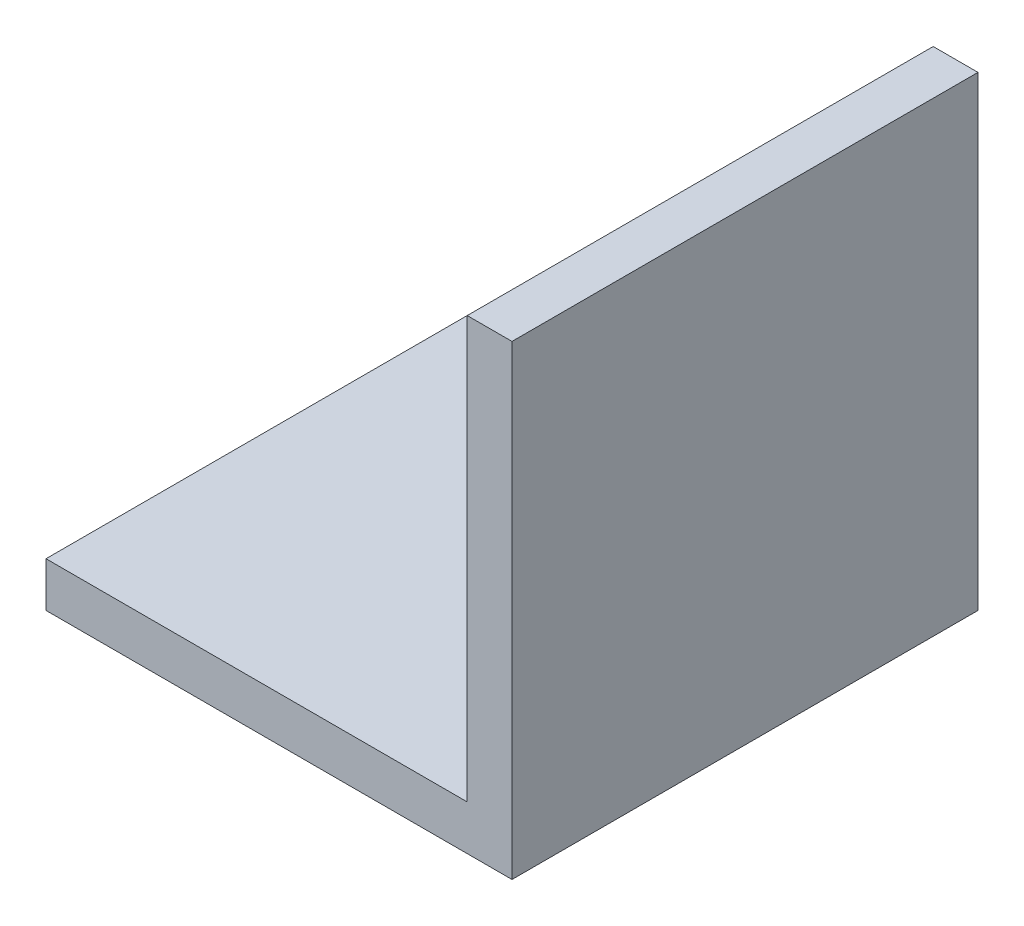
ISO-10303-21;
HEADER;
FILE_DESCRIPTION(('STEP AP214'),'2;1');
FILE_NAME('part.step','',(''),(''),'','','');
FILE_SCHEMA(('AUTOMOTIVE_DESIGN { 1 0 10303 214 1 1 1 1 }'));
ENDSEC;
DATA;
#1=APPLICATION_CONTEXT('core data for automotive mechanical design processes');
#2=APPLICATION_PROTOCOL_DEFINITION('international standard','automotive_design',2000,#1);
#3=PRODUCT_CONTEXT('',#1,'mechanical');
#4=PRODUCT('Part','Part','',(#3));
#5=PRODUCT_RELATED_PRODUCT_CATEGORY('part','',(#4));
#6=PRODUCT_DEFINITION_FORMATION('','',#4);
#7=PRODUCT_DEFINITION_CONTEXT('part definition',#1,'design');
#8=PRODUCT_DEFINITION('design','',#6,#7);
#9=PRODUCT_DEFINITION_SHAPE('','',#8);
#10=(LENGTH_UNIT() NAMED_UNIT(*) SI_UNIT(.MILLI.,.METRE.));
#11=(NAMED_UNIT(*) PLANE_ANGLE_UNIT() SI_UNIT($,.RADIAN.));
#12=(NAMED_UNIT(*) SI_UNIT($,.STERADIAN.) SOLID_ANGLE_UNIT());
#13=UNCERTAINTY_MEASURE_WITH_UNIT(LENGTH_MEASURE(1.E-05),#10,'distance_accuracy_value','');
#14=(GEOMETRIC_REPRESENTATION_CONTEXT(3) GLOBAL_UNCERTAINTY_ASSIGNED_CONTEXT((#13)) GLOBAL_UNIT_ASSIGNED_CONTEXT((#10,
#11,#12)) REPRESENTATION_CONTEXT('',''));
#15=CARTESIAN_POINT('',(0.,0.,0.));
#16=DIRECTION('',(0.,0.,1.));
#17=DIRECTION('',(1.,0.,0.));
#18=AXIS2_PLACEMENT_3D('',#15,#16,#17);
#19=CARTESIAN_POINT('',(-28.8799161585366,-1.57298018292683,41.275));
#20=DIRECTION('',(1.,0.,0.));
#21=DIRECTION('',(0.,0.,-1.));
#22=AXIS2_PLACEMENT_3D('',#19,#20,#21);
#23=PLANE('',#22);
#24=DIRECTION('',(0.,-1.,0.));
#25=VECTOR('',#24,1.);
#26=CARTESIAN_POINT('',(-28.8799161585366,-1.57298018292683,0.));
#27=LINE('',#26,#25);
#28=CARTESIAN_POINT('',(-28.8799161585366,-1.57298018292683,0.));
#29=VERTEX_POINT('',#28);
#30=CARTESIAN_POINT('',(-28.8799161585366,-5.54173018292683,0.));
#31=VERTEX_POINT('',#30);
#32=EDGE_CURVE('E134',#29,#31,#27,.T.);
#33=ORIENTED_EDGE('',*,*,#32,.T.);
#34=DIRECTION('',(0.,0.,-1.));
#35=VECTOR('',#34,1.);
#36=CARTESIAN_POINT('',(-28.8799161585366,-5.54173018292683,41.275));
#37=LINE('',#36,#35);
#38=CARTESIAN_POINT('',(-28.8799161585366,-5.54173018292683,41.275));
#39=VERTEX_POINT('',#38);
#40=EDGE_CURVE('E11',#39,#31,#37,.T.);
#41=ORIENTED_EDGE('',*,*,#40,.F.);
#42=DIRECTION('',(0.,-1.,0.));
#43=VECTOR('',#42,1.);
#44=CARTESIAN_POINT('',(-28.8799161585366,-1.57298018292683,41.275));
#45=LINE('',#44,#43);
#46=CARTESIAN_POINT('',(-28.8799161585366,-1.57298018292683,41.275));
#47=VERTEX_POINT('',#46);
#48=EDGE_CURVE('E150',#47,#39,#45,.T.);
#49=ORIENTED_EDGE('',*,*,#48,.F.);
#50=DIRECTION('',(0.,0.,-1.));
#51=VECTOR('',#50,1.);
#52=CARTESIAN_POINT('',(-28.8799161585366,-1.57298018292683,41.275));
#53=LINE('',#52,#51);
#54=EDGE_CURVE('E130',#47,#29,#53,.T.);
#55=ORIENTED_EDGE('',*,*,#54,.T.);
#56=EDGE_LOOP('',(#33,#41,#49,#55));
#57=FACE_BOUND('',#56,.T.);
#58=ADVANCED_FACE('F45',(#57),#23,.F.);
#59=CARTESIAN_POINT('',(-28.8799161585366,-5.54173018292683,41.275));
#60=DIRECTION('',(0.,1.,0.));
#61=DIRECTION('',(0.,0.,1.));
#62=AXIS2_PLACEMENT_3D('',#59,#60,#61);
#63=PLANE('',#62);
#64=DIRECTION('',(1.,0.,0.));
#65=VECTOR('',#64,1.);
#66=CARTESIAN_POINT('',(-28.8799161585366,-5.54173018292683,0.));
#67=LINE('',#66,#65);
#68=CARTESIAN_POINT('',(12.3950838414634,-5.54173018292683,0.));
#69=VERTEX_POINT('',#68);
#70=EDGE_CURVE('E138',#31,#69,#67,.T.);
#71=ORIENTED_EDGE('',*,*,#70,.T.);
#72=DIRECTION('',(0.,0.,-1.));
#73=VECTOR('',#72,1.);
#74=CARTESIAN_POINT('',(12.3950838414634,-5.54173018292683,41.275));
#75=LINE('',#74,#73);
#76=CARTESIAN_POINT('',(12.3950838414634,-5.54173018292683,41.275));
#77=VERTEX_POINT('',#76);
#78=EDGE_CURVE('E54',#77,#69,#75,.T.);
#79=ORIENTED_EDGE('',*,*,#78,.F.);
#80=DIRECTION('',(1.,0.,0.));
#81=VECTOR('',#80,1.);
#82=CARTESIAN_POINT('',(-28.8799161585366,-5.54173018292683,41.275));
#83=LINE('',#82,#81);
#84=EDGE_CURVE('E99',#39,#77,#83,.T.);
#85=ORIENTED_EDGE('',*,*,#84,.F.);
#86=ORIENTED_EDGE('',*,*,#40,.T.);
#87=EDGE_LOOP('',(#71,#79,#85,#86));
#88=FACE_BOUND('',#87,.T.);
#89=ADVANCED_FACE('F178',(#88),#63,.F.);
#90=CARTESIAN_POINT('',(12.3950838414634,-5.54173018292683,41.275));
#91=DIRECTION('',(-1.,0.,0.));
#92=DIRECTION('',(0.,-1.,0.));
#93=AXIS2_PLACEMENT_3D('',#90,#91,#92);
#94=PLANE('',#93);
#95=DIRECTION('',(0.,1.,0.));
#96=VECTOR('',#95,1.);
#97=CARTESIAN_POINT('',(12.3950838414634,-5.54173018292683,0.));
#98=LINE('',#97,#96);
#99=CARTESIAN_POINT('',(12.3950838414634,35.7332698170732,0.));
#100=VERTEX_POINT('',#99);
#101=EDGE_CURVE('E141',#69,#100,#98,.T.);
#102=ORIENTED_EDGE('',*,*,#101,.T.);
#103=DIRECTION('',(0.,0.,-1.));
#104=VECTOR('',#103,1.);
#105=CARTESIAN_POINT('',(12.3950838414634,35.7332698170732,41.275));
#106=LINE('',#105,#104);
#107=CARTESIAN_POINT('',(12.3950838414634,35.7332698170732,41.275));
#108=VERTEX_POINT('',#107);
#109=EDGE_CURVE('E123',#108,#100,#106,.T.);
#110=ORIENTED_EDGE('',*,*,#109,.F.);
#111=DIRECTION('',(0.,1.,0.));
#112=VECTOR('',#111,1.);
#113=CARTESIAN_POINT('',(12.3950838414634,-5.54173018292683,41.275));
#114=LINE('',#113,#112);
#115=EDGE_CURVE('E112',#77,#108,#114,.T.);
#116=ORIENTED_EDGE('',*,*,#115,.F.);
#117=ORIENTED_EDGE('',*,*,#78,.T.);
#118=EDGE_LOOP('',(#102,#110,#116,#117));
#119=FACE_BOUND('',#118,.T.);
#120=ADVANCED_FACE('F160',(#119),#94,.F.);
#121=CARTESIAN_POINT('',(12.3950838414634,35.7332698170732,41.275));
#122=DIRECTION('',(0.,-1.,0.));
#123=DIRECTION('',(1.,0.,0.));
#124=AXIS2_PLACEMENT_3D('',#121,#122,#123);
#125=PLANE('',#124);
#126=DIRECTION('',(-1.,0.,0.));
#127=VECTOR('',#126,1.);
#128=CARTESIAN_POINT('',(12.3950838414634,35.7332698170732,0.));
#129=LINE('',#128,#127);
#130=CARTESIAN_POINT('',(8.42633384146341,35.7332698170732,0.));
#131=VERTEX_POINT('',#130);
#132=EDGE_CURVE('E121',#100,#131,#129,.T.);
#133=ORIENTED_EDGE('',*,*,#132,.T.);
#134=DIRECTION('',(0.,0.,-1.));
#135=VECTOR('',#134,1.);
#136=CARTESIAN_POINT('',(8.42633384146341,35.7332698170732,41.275));
#137=LINE('',#136,#135);
#138=CARTESIAN_POINT('',(8.42633384146341,35.7332698170732,41.275));
#139=VERTEX_POINT('',#138);
#140=EDGE_CURVE('E118',#139,#131,#137,.T.);
#141=ORIENTED_EDGE('',*,*,#140,.F.);
#142=DIRECTION('',(-1.,0.,0.));
#143=VECTOR('',#142,1.);
#144=CARTESIAN_POINT('',(12.3950838414634,35.7332698170732,41.275));
#145=LINE('',#144,#143);
#146=EDGE_CURVE('E106',#108,#139,#145,.T.);
#147=ORIENTED_EDGE('',*,*,#146,.F.);
#148=ORIENTED_EDGE('',*,*,#109,.T.);
#149=EDGE_LOOP('',(#133,#141,#147,#148));
#150=FACE_BOUND('',#149,.T.);
#151=ADVANCED_FACE('F119',(#150),#125,.F.);
#152=CARTESIAN_POINT('',(8.42633384146341,-1.57298018292684,41.275));
#153=DIRECTION('',(1.,0.,0.));
#154=DIRECTION('',(0.,1.,0.));
#155=AXIS2_PLACEMENT_3D('',#152,#153,#154);
#156=PLANE('',#155);
#157=DIRECTION('',(0.,-1.,0.));
#158=VECTOR('',#157,1.);
#159=CARTESIAN_POINT('',(8.42633384146341,-1.57298018292684,0.));
#160=LINE('',#159,#158);
#161=CARTESIAN_POINT('',(8.42633384146341,-1.57298018292684,0.));
#162=VERTEX_POINT('',#161);
#163=EDGE_CURVE('E85',#131,#162,#160,.T.);
#164=ORIENTED_EDGE('',*,*,#163,.T.);
#165=DIRECTION('',(0.,0.,-1.));
#166=VECTOR('',#165,1.);
#167=CARTESIAN_POINT('',(8.42633384146341,-1.57298018292684,41.275));
#168=LINE('',#167,#166);
#169=CARTESIAN_POINT('',(8.42633384146341,-1.57298018292684,41.275));
#170=VERTEX_POINT('',#169);
#171=EDGE_CURVE('E124',#170,#162,#168,.T.);
#172=ORIENTED_EDGE('',*,*,#171,.F.);
#173=DIRECTION('',(0.,-1.,0.));
#174=VECTOR('',#173,1.);
#175=CARTESIAN_POINT('',(8.42633384146341,-1.57298018292684,41.275));
#176=LINE('',#175,#174);
#177=EDGE_CURVE('E110',#139,#170,#176,.T.);
#178=ORIENTED_EDGE('',*,*,#177,.F.);
#179=ORIENTED_EDGE('',*,*,#140,.T.);
#180=EDGE_LOOP('',(#164,#172,#178,#179));
#181=FACE_BOUND('',#180,.T.);
#182=ADVANCED_FACE('F126',(#181),#156,.F.);
#183=CARTESIAN_POINT('',(-28.8799161585366,-1.57298018292683,41.275));
#184=DIRECTION('',(0.,-1.,0.));
#185=DIRECTION('',(1.,0.,0.));
#186=AXIS2_PLACEMENT_3D('',#183,#184,#185);
#187=PLANE('',#186);
#188=DIRECTION('',(-1.,0.,0.));
#189=VECTOR('',#188,1.);
#190=CARTESIAN_POINT('',(-28.8799161585366,-1.57298018292683,0.));
#191=LINE('',#190,#189);
#192=EDGE_CURVE('E91',#162,#29,#191,.T.);
#193=ORIENTED_EDGE('',*,*,#192,.T.);
#194=ORIENTED_EDGE('',*,*,#54,.F.);
#195=DIRECTION('',(-1.,0.,0.));
#196=VECTOR('',#195,1.);
#197=CARTESIAN_POINT('',(-28.8799161585366,-1.57298018292683,41.275));
#198=LINE('',#197,#196);
#199=EDGE_CURVE('E62',#170,#47,#198,.T.);
#200=ORIENTED_EDGE('',*,*,#199,.F.);
#201=ORIENTED_EDGE('',*,*,#171,.T.);
#202=EDGE_LOOP('',(#193,#194,#200,#201));
#203=FACE_BOUND('',#202,.T.);
#204=ADVANCED_FACE('F167',(#203),#187,.F.);
#205=CARTESIAN_POINT('',(0.,0.,41.275));
#206=DIRECTION('',(0.,0.,1.));
#207=DIRECTION('',(1.,0.,0.));
#208=AXIS2_PLACEMENT_3D('',#205,#206,#207);
#209=PLANE('',#208);
#210=ORIENTED_EDGE('',*,*,#48,.T.);
#211=ORIENTED_EDGE('',*,*,#84,.T.);
#212=ORIENTED_EDGE('',*,*,#115,.T.);
#213=ORIENTED_EDGE('',*,*,#146,.T.);
#214=ORIENTED_EDGE('',*,*,#177,.T.);
#215=ORIENTED_EDGE('',*,*,#199,.T.);
#216=EDGE_LOOP('',(#210,#211,#212,#213,#214,#215));
#217=FACE_BOUND('',#216,.T.);
#218=ADVANCED_FACE('F108',(#217),#209,.T.);
#219=CARTESIAN_POINT('',(0.,0.,0.));
#220=DIRECTION('',(0.,0.,1.));
#221=DIRECTION('',(1.,0.,0.));
#222=AXIS2_PLACEMENT_3D('',#219,#220,#221);
#223=PLANE('',#222);
#224=ORIENTED_EDGE('',*,*,#32,.F.);
#225=ORIENTED_EDGE('',*,*,#192,.F.);
#226=ORIENTED_EDGE('',*,*,#163,.F.);
#227=ORIENTED_EDGE('',*,*,#132,.F.);
#228=ORIENTED_EDGE('',*,*,#101,.F.);
#229=ORIENTED_EDGE('',*,*,#70,.F.);
#230=EDGE_LOOP('',(#224,#225,#226,#227,#228,#229));
#231=FACE_BOUND('',#230,.T.);
#232=ADVANCED_FACE('F163',(#231),#223,.F.);
#233=CLOSED_SHELL('',(#58,#89,#120,#151,#182,#204,#218,#232));
#234=MANIFOLD_SOLID_BREP('B2',#233);
#235=ADVANCED_BREP_SHAPE_REPRESENTATION('',(#18,#234),#14);
#236=SHAPE_DEFINITION_REPRESENTATION(#9,#235);
ENDSEC;
END-ISO-10303-21;
